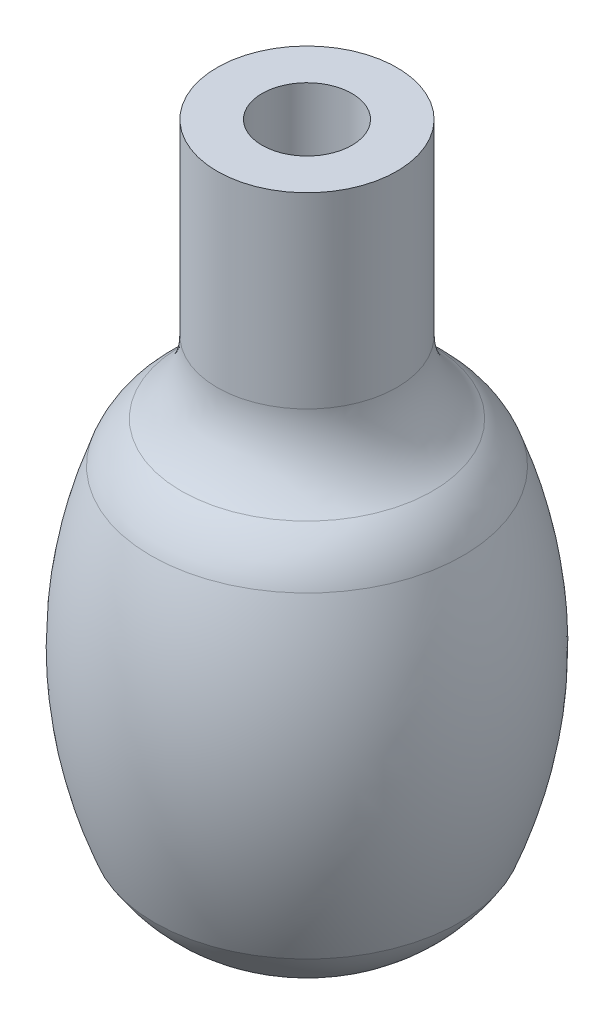
ISO-10303-21;
HEADER;
FILE_DESCRIPTION(('STEP AP214'),'2;1');
FILE_NAME('part.step','',(''),(''),'','','');
FILE_SCHEMA(('AUTOMOTIVE_DESIGN { 1 0 10303 214 1 1 1 1 }'));
ENDSEC;
DATA;
#1=APPLICATION_CONTEXT('core data for automotive mechanical design processes');
#2=APPLICATION_PROTOCOL_DEFINITION('international standard','automotive_design',2000,#1);
#3=PRODUCT_CONTEXT('',#1,'mechanical');
#4=PRODUCT('Part','Part','',(#3));
#5=PRODUCT_RELATED_PRODUCT_CATEGORY('part','',(#4));
#6=PRODUCT_DEFINITION_FORMATION('','',#4);
#7=PRODUCT_DEFINITION_CONTEXT('part definition',#1,'design');
#8=PRODUCT_DEFINITION('design','',#6,#7);
#9=PRODUCT_DEFINITION_SHAPE('','',#8);
#10=(LENGTH_UNIT() NAMED_UNIT(*) SI_UNIT(.MILLI.,.METRE.));
#11=(NAMED_UNIT(*) PLANE_ANGLE_UNIT() SI_UNIT($,.RADIAN.));
#12=(NAMED_UNIT(*) SI_UNIT($,.STERADIAN.) SOLID_ANGLE_UNIT());
#13=UNCERTAINTY_MEASURE_WITH_UNIT(LENGTH_MEASURE(1.E-05),#10,'distance_accuracy_value','');
#14=(GEOMETRIC_REPRESENTATION_CONTEXT(3) GLOBAL_UNCERTAINTY_ASSIGNED_CONTEXT((#13)) GLOBAL_UNIT_ASSIGNED_CONTEXT((#10,
#11,#12)) REPRESENTATION_CONTEXT('',''));
#15=CARTESIAN_POINT('',(0.,0.,0.));
#16=DIRECTION('',(0.,0.,1.));
#17=DIRECTION('',(1.,0.,0.));
#18=AXIS2_PLACEMENT_3D('',#15,#16,#17);
#19=CARTESIAN_POINT('',(0.,23.343986428663,5.));
#20=DIRECTION('',(0.,1.,0.));
#21=DIRECTION('',(0.,0.,1.));
#22=AXIS2_PLACEMENT_3D('',#19,#20,#21);
#23=PLANE('',#22);
#24=CARTESIAN_POINT('',(0.,23.343986428663,0.));
#25=DIRECTION('',(0.,1.,0.));
#26=DIRECTION('',(0.,0.,1.));
#27=AXIS2_PLACEMENT_3D('',#24,#25,#26);
#28=CIRCLE('',#27,2.5);
#29=CARTESIAN_POINT('',(0.,23.343986428663,2.5));
#30=VERTEX_POINT('',#29);
#31=EDGE_CURVE('E66',#30,#30,#28,.T.);
#32=ORIENTED_EDGE('',*,*,#31,.F.);
#33=EDGE_LOOP('',(#32));
#34=FACE_BOUND('',#33,.T.);
#35=CARTESIAN_POINT('',(0.,23.343986428663,0.));
#36=DIRECTION('',(0.,1.,0.));
#37=DIRECTION('',(0.,0.,1.));
#38=AXIS2_PLACEMENT_3D('',#35,#36,#37);
#39=CIRCLE('',#38,5.);
#40=CARTESIAN_POINT('',(0.,23.343986428663,5.));
#41=VERTEX_POINT('',#40);
#42=EDGE_CURVE('E129',#41,#41,#39,.T.);
#43=ORIENTED_EDGE('',*,*,#42,.T.);
#44=EDGE_LOOP('',(#43));
#45=FACE_BOUND('',#44,.T.);
#46=ADVANCED_FACE('F38',(#34,#45),#23,.T.);
#47=CARTESIAN_POINT('',(0.,-11.108032864833,8.48389384171746));
#48=CARTESIAN_POINT('',(0.,-15.4344610860314,5.82069714179185));
#49=CARTESIAN_POINT('',(0.,-15.4543079349097,0.));
#50=B_SPLINE_CURVE_WITH_KNOTS('',2,(#47,#48,#49),.UNSPECIFIED.,.F.,.F.,(3,3),(0.,1.),.UNSPECIFIED.);
#51=CARTESIAN_POINT('',(0.,38.8904716153956,0.));
#52=DIRECTION('',(0.,1.,0.));
#53=AXIS1_PLACEMENT('',#51,#52);
#54=SURFACE_OF_REVOLUTION('',#50,#53);
#55=CARTESIAN_POINT('',(0.,-15.4543079349097,0.));
#56=VERTEX_POINT('',#55);
#57=VERTEX_LOOP('',#56);
#58=FACE_BOUND('',#57,.T.);
#59=CARTESIAN_POINT('',(0.,-11.108032864833,0.));
#60=DIRECTION('',(0.,1.,0.));
#61=DIRECTION('',(0.,0.,1.));
#62=AXIS2_PLACEMENT_3D('',#59,#60,#61);
#63=CIRCLE('',#62,8.48389384171746);
#64=CARTESIAN_POINT('',(0.,-11.108032864833,8.48389384171746));
#65=VERTEX_POINT('',#64);
#66=EDGE_CURVE('E135',#65,#65,#63,.T.);
#67=ORIENTED_EDGE('',*,*,#66,.F.);
#68=EDGE_LOOP('',(#67));
#69=FACE_BOUND('',#68,.T.);
#70=ADVANCED_FACE('F100',(#58,#69),#54,.F.);
#71=CARTESIAN_POINT('',(0.,8.343986428663,8.));
#72=CARTESIAN_POINT('',(0.,-1.42362785067541,12.2703179095879));
#73=CARTESIAN_POINT('',(0.,-11.108032864833,8.48389384171746));
#74=B_SPLINE_CURVE_WITH_KNOTS('',2,(#71,#72,#73),.UNSPECIFIED.,.F.,.F.,(3,3),(0.,1.),.UNSPECIFIED.);
#75=CARTESIAN_POINT('',(0.,38.8904716153956,0.));
#76=DIRECTION('',(0.,1.,0.));
#77=AXIS1_PLACEMENT('',#75,#76);
#78=SURFACE_OF_REVOLUTION('',#74,#77);
#79=CARTESIAN_POINT('',(0.,6.6603515265032,0.));
#80=DIRECTION('',(0.,1.,0.));
#81=DIRECTION('',(0.,0.,1.));
#82=AXIS2_PLACEMENT_3D('',#79,#80,#81);
#83=CIRCLE('',#82,8.67645361365601);
#84=CARTESIAN_POINT('',(0.,6.6603515265032,8.67645361365601));
#85=VERTEX_POINT('',#84);
#86=EDGE_CURVE('E11',#85,#85,#83,.F.);
#87=ORIENTED_EDGE('',*,*,#86,.T.);
#88=EDGE_LOOP('',(#87));
#89=FACE_BOUND('',#88,.T.);
#90=ORIENTED_EDGE('',*,*,#66,.T.);
#91=EDGE_LOOP('',(#90));
#92=FACE_BOUND('',#91,.T.);
#93=ADVANCED_FACE('F95',(#89,#92),#78,.F.);
#94=CARTESIAN_POINT('',(0.,38.8904716153956,0.));
#95=DIRECTION('',(0.,1.,0.));
#96=DIRECTION('',(0.,0.,1.));
#97=AXIS2_PLACEMENT_3D('',#94,#95,#96);
#98=CYLINDRICAL_SURFACE('',#97,5.);
#99=CARTESIAN_POINT('',(0.,12.9265621236188,0.));
#100=DIRECTION('',(0.,-1.,0.));
#101=DIRECTION('',(0.,0.,-1.));
#102=AXIS2_PLACEMENT_3D('',#99,#100,#101);
#103=CIRCLE('',#102,5.);
#104=CARTESIAN_POINT('',(0.,12.9265621236188,-5.));
#105=VERTEX_POINT('',#104);
#106=EDGE_CURVE('E138',#105,#105,#103,.F.);
#107=ORIENTED_EDGE('',*,*,#106,.T.);
#108=EDGE_LOOP('',(#107));
#109=FACE_BOUND('',#108,.T.);
#110=ORIENTED_EDGE('',*,*,#42,.F.);
#111=EDGE_LOOP('',(#110));
#112=FACE_BOUND('',#111,.T.);
#113=ADVANCED_FACE('F99',(#109,#112),#98,.T.);
#114=CARTESIAN_POINT('',(0.,8.343986428663,0.));
#115=DIRECTION('',(0.,1.,0.));
#116=DIRECTION('',(0.,0.,1.));
#117=AXIS2_PLACEMENT_3D('',#114,#115,#116);
#118=CYLINDRICAL_SURFACE('',#117,2.5);
#119=CARTESIAN_POINT('',(0.,8.343986428663,0.));
#120=DIRECTION('',(0.,1.,0.));
#121=DIRECTION('',(0.,0.,1.));
#122=AXIS2_PLACEMENT_3D('',#119,#120,#121);
#123=CIRCLE('',#122,2.5);
#124=CARTESIAN_POINT('',(0.,8.343986428663,2.5));
#125=VERTEX_POINT('',#124);
#126=EDGE_CURVE('E62',#125,#125,#123,.T.);
#127=ORIENTED_EDGE('',*,*,#126,.F.);
#128=EDGE_LOOP('',(#127));
#129=FACE_BOUND('',#128,.T.);
#130=ORIENTED_EDGE('',*,*,#31,.T.);
#131=EDGE_LOOP('',(#130));
#132=FACE_BOUND('',#131,.T.);
#133=ADVANCED_FACE('F114',(#129,#132),#118,.F.);
#134=CARTESIAN_POINT('',(0.,22.343986428663,5.));
#135=DIRECTION('',(0.,1.,0.));
#136=DIRECTION('',(0.,0.,1.));
#137=AXIS2_PLACEMENT_3D('',#134,#135,#136);
#138=PLANE('',#137);
#139=CARTESIAN_POINT('',(0.,22.343986428663,0.));
#140=DIRECTION('',(0.,1.,0.));
#141=DIRECTION('',(0.,0.,1.));
#142=AXIS2_PLACEMENT_3D('',#139,#140,#141);
#143=CIRCLE('',#142,3.5);
#144=CARTESIAN_POINT('',(0.,22.343986428663,3.5));
#145=VERTEX_POINT('',#144);
#146=EDGE_CURVE('E77',#145,#145,#143,.T.);
#147=ORIENTED_EDGE('',*,*,#146,.T.);
#148=EDGE_LOOP('',(#147));
#149=FACE_BOUND('',#148,.T.);
#150=CARTESIAN_POINT('',(0.,22.343986428663,0.));
#151=DIRECTION('',(0.,1.,0.));
#152=DIRECTION('',(0.,0.,1.));
#153=AXIS2_PLACEMENT_3D('',#150,#151,#152);
#154=CIRCLE('',#153,4.);
#155=CARTESIAN_POINT('',(0.,22.343986428663,4.));
#156=VERTEX_POINT('',#155);
#157=EDGE_CURVE('E76',#156,#156,#154,.T.);
#158=ORIENTED_EDGE('',*,*,#157,.F.);
#159=EDGE_LOOP('',(#158));
#160=FACE_BOUND('',#159,.T.);
#161=ADVANCED_FACE('F56',(#149,#160),#138,.F.);
#162=CARTESIAN_POINT('',(0.,-11.108032864833,8.48389384171746));
#163=CARTESIAN_POINT('',(0.,-15.4331075370297,5.82153033884263));
#164=CARTESIAN_POINT('',(0.,-15.4542950949751,0.00364177092761247));
#165=B_SPLINE_CURVE_WITH_KNOTS('',2,(#162,#163,#164),.UNSPECIFIED.,.F.,.F.,(3,3),(0.,
0.999687144005995),.UNSPECIFIED.);
#166=CARTESIAN_POINT('',(0.,38.8904716153956,0.));
#167=DIRECTION('',(0.,1.,0.));
#168=AXIS1_PLACEMENT('',#166,#167);
#169=SURFACE_OF_REVOLUTION('',#165,#168);
#170=OFFSET_SURFACE('',#169,1.,.F.);
#171=CARTESIAN_POINT('',(0.,-14.4543017262448,3.10689143954036E-13));
#172=VERTEX_POINT('',#171);
#173=VERTEX_LOOP('',#172);
#174=FACE_BOUND('',#173,.T.);
#175=CARTESIAN_POINT('',(0.,-10.6588280361111,0.));
#176=DIRECTION('',(0.,1.,0.));
#177=DIRECTION('',(0.,0.,1.));
#178=AXIS2_PLACEMENT_3D('',#175,#176,#177);
#179=CIRCLE('',#178,7.58564673475398);
#180=CARTESIAN_POINT('',(0.,-10.6588280361111,7.58564673475398));
#181=VERTEX_POINT('',#180);
#182=EDGE_CURVE('E60',#181,#181,#179,.T.);
#183=ORIENTED_EDGE('',*,*,#182,.T.);
#184=EDGE_LOOP('',(#183));
#185=FACE_BOUND('',#184,.T.);
#186=ADVANCED_FACE('F52',(#174,#185),#170,.T.);
#187=CARTESIAN_POINT('',(0.,8.343986428663,8.));
#188=CARTESIAN_POINT('',(0.,-1.42362785067541,12.2703179095879));
#189=CARTESIAN_POINT('',(0.,-11.108032864833,8.48389384171746));
#190=B_SPLINE_CURVE_WITH_KNOTS('',2,(#187,#188,#189),.UNSPECIFIED.,.F.,.F.,(3,3),(0.,1.),.UNSPECIFIED.);
#191=CARTESIAN_POINT('',(0.,38.8904716153956,0.));
#192=DIRECTION('',(0.,1.,0.));
#193=AXIS1_PLACEMENT('',#191,#192);
#194=SURFACE_OF_REVOLUTION('',#190,#193);
#195=OFFSET_SURFACE('',#194,1.,.F.);
#196=ORIENTED_EDGE('',*,*,#182,.F.);
#197=EDGE_LOOP('',(#196));
#198=FACE_BOUND('',#197,.T.);
#199=CARTESIAN_POINT('',(0.,7.34398642866298,0.));
#200=DIRECTION('',(0.,1.,0.));
#201=DIRECTION('',(0.,0.,1.));
#202=AXIS2_PLACEMENT_3D('',#199,#200,#201);
#203=CIRCLE('',#202,7.33799133836665);
#204=CARTESIAN_POINT('',(0.,7.34398642866298,7.33799133836665));
#205=VERTEX_POINT('',#204);
#206=EDGE_CURVE('E63',#205,#205,#203,.T.);
#207=ORIENTED_EDGE('',*,*,#206,.T.);
#208=EDGE_LOOP('',(#207));
#209=FACE_BOUND('',#208,.T.);
#210=ADVANCED_FACE('F55',(#198,#209),#195,.T.);
#211=CARTESIAN_POINT('',(0.,7.343986428663,5.));
#212=DIRECTION('',(0.,1.,0.));
#213=DIRECTION('',(0.,0.,1.));
#214=AXIS2_PLACEMENT_3D('',#211,#212,#213);
#215=PLANE('',#214);
#216=ORIENTED_EDGE('',*,*,#206,.F.);
#217=EDGE_LOOP('',(#216));
#218=FACE_BOUND('',#217,.T.);
#219=CARTESIAN_POINT('',(0.,7.343986428663,0.));
#220=DIRECTION('',(0.,1.,0.));
#221=DIRECTION('',(0.,0.,1.));
#222=AXIS2_PLACEMENT_3D('',#219,#220,#221);
#223=CIRCLE('',#222,4.);
#224=CARTESIAN_POINT('',(0.,7.343986428663,4.));
#225=VERTEX_POINT('',#224);
#226=EDGE_CURVE('E69',#225,#225,#223,.T.);
#227=ORIENTED_EDGE('',*,*,#226,.T.);
#228=EDGE_LOOP('',(#227));
#229=FACE_BOUND('',#228,.T.);
#230=ADVANCED_FACE('F94',(#218,#229),#215,.F.);
#231=CARTESIAN_POINT('',(0.,38.8904716153956,0.));
#232=DIRECTION('',(0.,1.,0.));
#233=DIRECTION('',(0.,0.,1.));
#234=AXIS2_PLACEMENT_3D('',#231,#232,#233);
#235=CYLINDRICAL_SURFACE('',#234,4.);
#236=ORIENTED_EDGE('',*,*,#226,.F.);
#237=EDGE_LOOP('',(#236));
#238=FACE_BOUND('',#237,.T.);
#239=ORIENTED_EDGE('',*,*,#157,.T.);
#240=EDGE_LOOP('',(#239));
#241=FACE_BOUND('',#240,.T.);
#242=ADVANCED_FACE('F104',(#238,#241),#235,.F.);
#243=CARTESIAN_POINT('',(0.,8.343986428663,0.));
#244=DIRECTION('',(0.,1.,0.));
#245=DIRECTION('',(0.,0.,1.));
#246=AXIS2_PLACEMENT_3D('',#243,#244,#245);
#247=CYLINDRICAL_SURFACE('',#246,3.5);
#248=CARTESIAN_POINT('',(0.,8.343986428663,0.));
#249=DIRECTION('',(0.,1.,0.));
#250=DIRECTION('',(0.,0.,1.));
#251=AXIS2_PLACEMENT_3D('',#248,#249,#250);
#252=CIRCLE('',#251,3.5);
#253=CARTESIAN_POINT('',(0.,8.343986428663,3.5));
#254=VERTEX_POINT('',#253);
#255=EDGE_CURVE('E73',#254,#254,#252,.T.);
#256=ORIENTED_EDGE('',*,*,#255,.T.);
#257=EDGE_LOOP('',(#256));
#258=FACE_BOUND('',#257,.T.);
#259=ORIENTED_EDGE('',*,*,#146,.F.);
#260=EDGE_LOOP('',(#259));
#261=FACE_BOUND('',#260,.T.);
#262=ADVANCED_FACE('F108',(#258,#261),#247,.T.);
#263=CARTESIAN_POINT('',(0.,8.343986428663,0.));
#264=DIRECTION('',(0.,1.,0.));
#265=DIRECTION('',(0.,0.,1.));
#266=AXIS2_PLACEMENT_3D('',#263,#264,#265);
#267=PLANE('',#266);
#268=ORIENTED_EDGE('',*,*,#126,.T.);
#269=EDGE_LOOP('',(#268));
#270=FACE_BOUND('',#269,.T.);
#271=ORIENTED_EDGE('',*,*,#255,.F.);
#272=EDGE_LOOP('',(#271));
#273=FACE_BOUND('',#272,.T.);
#274=ADVANCED_FACE('F112',(#270,#273),#267,.F.);
#275=CARTESIAN_POINT('',(0.,12.9265621236188,0.));
#276=DIRECTION('',(0.,-1.,0.));
#277=DIRECTION('',(0.,0.,-1.));
#278=AXIS2_PLACEMENT_3D('',#275,#276,#277);
#279=TOROIDAL_SURFACE('',#278,10.,5.);
#280=CARTESIAN_POINT('',(0.,8.93348422293588,0.));
#281=DIRECTION('',(0.,1.,0.));
#282=DIRECTION('',(0.,0.,1.));
#283=AXIS2_PLACEMENT_3D('',#280,#281,#282);
#284=CIRCLE('',#283,6.99079264937138);
#285=CARTESIAN_POINT('',(0.,8.93348422293588,6.99079264937138));
#286=VERTEX_POINT('',#285);
#287=EDGE_CURVE('E46',#286,#286,#284,.T.);
#288=ORIENTED_EDGE('',*,*,#287,.T.);
#289=EDGE_LOOP('',(#288));
#290=FACE_BOUND('',#289,.T.);
#291=ORIENTED_EDGE('',*,*,#106,.F.);
#292=EDGE_LOOP('',(#291));
#293=FACE_BOUND('',#292,.T.);
#294=ADVANCED_FACE('F143',(#290,#293),#279,.F.);
#295=CARTESIAN_POINT('',(0.,4.94040632225291,0.));
#296=DIRECTION('',(0.,-1.,0.));
#297=DIRECTION('',(0.,0.,-1.));
#298=AXIS2_PLACEMENT_3D('',#295,#296,#297);
#299=DEGENERATE_TOROIDAL_SURFACE('',#298,3.98158529874275,5.,.T.);
#300=ORIENTED_EDGE('',*,*,#86,.F.);
#301=EDGE_LOOP('',(#300));
#302=FACE_BOUND('',#301,.T.);
#303=ORIENTED_EDGE('',*,*,#287,.F.);
#304=EDGE_LOOP('',(#303));
#305=FACE_BOUND('',#304,.T.);
#306=ADVANCED_FACE('F40',(#302,#305),#299,.T.);
#307=CLOSED_SHELL('',(#46,#70,#93,#113,#133,#161,#186,#210,#230,#242,#262,#274,#294,#306));
#308=MANIFOLD_SOLID_BREP('B2',#307);
#309=ADVANCED_BREP_SHAPE_REPRESENTATION('',(#18,#308),#14);
#310=SHAPE_DEFINITION_REPRESENTATION(#9,#309);
ENDSEC;
END-ISO-10303-21;
